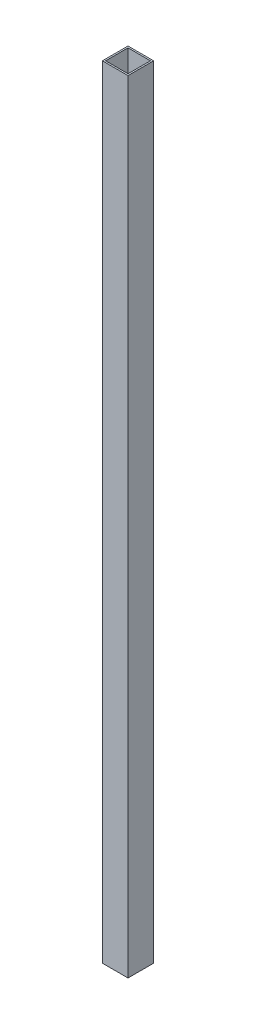
ISO-10303-21;
HEADER;
FILE_DESCRIPTION(('STEP AP214'),'2;1');
FILE_NAME('part.step','',(''),(''),'','','');
FILE_SCHEMA(('AUTOMOTIVE_DESIGN { 1 0 10303 214 1 1 1 1 }'));
ENDSEC;
DATA;
#1=APPLICATION_CONTEXT('core data for automotive mechanical design processes');
#2=APPLICATION_PROTOCOL_DEFINITION('international standard','automotive_design',2000,#1);
#3=PRODUCT_CONTEXT('',#1,'mechanical');
#4=PRODUCT('Part','Part','',(#3));
#5=PRODUCT_RELATED_PRODUCT_CATEGORY('part','',(#4));
#6=PRODUCT_DEFINITION_FORMATION('','',#4);
#7=PRODUCT_DEFINITION_CONTEXT('part definition',#1,'design');
#8=PRODUCT_DEFINITION('design','',#6,#7);
#9=PRODUCT_DEFINITION_SHAPE('','',#8);
#10=(LENGTH_UNIT() NAMED_UNIT(*) SI_UNIT(.MILLI.,.METRE.));
#11=(NAMED_UNIT(*) PLANE_ANGLE_UNIT() SI_UNIT($,.RADIAN.));
#12=(NAMED_UNIT(*) SI_UNIT($,.STERADIAN.) SOLID_ANGLE_UNIT());
#13=UNCERTAINTY_MEASURE_WITH_UNIT(LENGTH_MEASURE(1.E-05),#10,'distance_accuracy_value','');
#14=(GEOMETRIC_REPRESENTATION_CONTEXT(3) GLOBAL_UNCERTAINTY_ASSIGNED_CONTEXT((#13)) GLOBAL_UNIT_ASSIGNED_CONTEXT((#10,
#11,#12)) REPRESENTATION_CONTEXT('',''));
#15=CARTESIAN_POINT('',(0.,0.,0.));
#16=DIRECTION('',(0.,0.,1.));
#17=DIRECTION('',(1.,0.,0.));
#18=AXIS2_PLACEMENT_3D('',#15,#16,#17);
#19=CARTESIAN_POINT('',(-12.7,0.,12.7));
#20=DIRECTION('',(0.,-1.,0.));
#21=DIRECTION('',(0.,0.,-1.));
#22=AXIS2_PLACEMENT_3D('',#19,#20,#21);
#23=PLANE('',#22);
#24=DIRECTION('',(1.,0.,0.));
#25=VECTOR('',#24,1.);
#26=CARTESIAN_POINT('',(0.,0.,-11.1125));
#27=LINE('',#26,#25);
#28=CARTESIAN_POINT('',(-11.1125,0.,-11.1125));
#29=VERTEX_POINT('',#28);
#30=CARTESIAN_POINT('',(11.1125,0.,-11.1125));
#31=VERTEX_POINT('',#30);
#32=EDGE_CURVE('E108',#29,#31,#27,.T.);
#33=ORIENTED_EDGE('',*,*,#32,.F.);
#34=DIRECTION('',(0.,0.,-1.));
#35=VECTOR('',#34,1.);
#36=CARTESIAN_POINT('',(-11.1125,0.,0.));
#37=LINE('',#36,#35);
#38=CARTESIAN_POINT('',(-11.1125,0.,11.1125));
#39=VERTEX_POINT('',#38);
#40=EDGE_CURVE('E110',#39,#29,#37,.T.);
#41=ORIENTED_EDGE('',*,*,#40,.F.);
#42=DIRECTION('',(-1.,0.,0.));
#43=VECTOR('',#42,1.);
#44=CARTESIAN_POINT('',(0.,0.,11.1125));
#45=LINE('',#44,#43);
#46=CARTESIAN_POINT('',(11.1125,0.,11.1125));
#47=VERTEX_POINT('',#46);
#48=EDGE_CURVE('E114',#47,#39,#45,.T.);
#49=ORIENTED_EDGE('',*,*,#48,.F.);
#50=DIRECTION('',(0.,0.,1.));
#51=VECTOR('',#50,1.);
#52=CARTESIAN_POINT('',(11.1125,0.,0.));
#53=LINE('',#52,#51);
#54=EDGE_CURVE('E118',#31,#47,#53,.T.);
#55=ORIENTED_EDGE('',*,*,#54,.F.);
#56=EDGE_LOOP('',(#33,#41,#49,#55));
#57=FACE_BOUND('',#56,.T.);
#58=DIRECTION('',(0.,0.,-1.));
#59=VECTOR('',#58,1.);
#60=CARTESIAN_POINT('',(-12.7,0.,0.));
#61=LINE('',#60,#59);
#62=CARTESIAN_POINT('',(-12.7,0.,12.7));
#63=VERTEX_POINT('',#62);
#64=CARTESIAN_POINT('',(-12.7,0.,-12.7));
#65=VERTEX_POINT('',#64);
#66=EDGE_CURVE('E78',#63,#65,#61,.T.);
#67=ORIENTED_EDGE('',*,*,#66,.T.);
#68=DIRECTION('',(1.,0.,0.));
#69=VECTOR('',#68,1.);
#70=CARTESIAN_POINT('',(0.,0.,-12.7));
#71=LINE('',#70,#69);
#72=CARTESIAN_POINT('',(12.7,0.,-12.7));
#73=VERTEX_POINT('',#72);
#74=EDGE_CURVE('E100',#65,#73,#71,.T.);
#75=ORIENTED_EDGE('',*,*,#74,.T.);
#76=DIRECTION('',(0.,0.,1.));
#77=VECTOR('',#76,1.);
#78=CARTESIAN_POINT('',(12.7,0.,0.));
#79=LINE('',#78,#77);
#80=CARTESIAN_POINT('',(12.7,0.,12.7));
#81=VERTEX_POINT('',#80);
#82=EDGE_CURVE('E82',#73,#81,#79,.T.);
#83=ORIENTED_EDGE('',*,*,#82,.T.);
#84=DIRECTION('',(-1.,0.,0.));
#85=VECTOR('',#84,1.);
#86=CARTESIAN_POINT('',(0.,0.,12.7));
#87=LINE('',#86,#85);
#88=EDGE_CURVE('E20',#81,#63,#87,.T.);
#89=ORIENTED_EDGE('',*,*,#88,.T.);
#90=EDGE_LOOP('',(#67,#75,#83,#89));
#91=FACE_BOUND('',#90,.T.);
#92=ADVANCED_FACE('F16',(#57,#91),#23,.T.);
#93=CARTESIAN_POINT('',(12.7,0.,12.7));
#94=DIRECTION('',(0.,0.,-1.));
#95=DIRECTION('',(-1.,0.,0.));
#96=AXIS2_PLACEMENT_3D('',#93,#94,#95);
#97=PLANE('',#96);
#98=DIRECTION('',(0.,1.,0.));
#99=VECTOR('',#98,1.);
#100=CARTESIAN_POINT('',(12.7,387.35,12.7));
#101=LINE('',#100,#99);
#102=CARTESIAN_POINT('',(12.7,774.7,12.7));
#103=VERTEX_POINT('',#102);
#104=EDGE_CURVE('E102',#81,#103,#101,.T.);
#105=ORIENTED_EDGE('',*,*,#104,.T.);
#106=DIRECTION('',(-1.,0.,0.));
#107=VECTOR('',#106,1.);
#108=CARTESIAN_POINT('',(0.,774.7,12.7));
#109=LINE('',#108,#107);
#110=CARTESIAN_POINT('',(-12.7,774.7,12.7));
#111=VERTEX_POINT('',#110);
#112=EDGE_CURVE('E97',#103,#111,#109,.T.);
#113=ORIENTED_EDGE('',*,*,#112,.T.);
#114=DIRECTION('',(0.,-1.,0.));
#115=VECTOR('',#114,1.);
#116=CARTESIAN_POINT('',(-12.7,387.35,12.7));
#117=LINE('',#116,#115);
#118=EDGE_CURVE('E87',#111,#63,#117,.T.);
#119=ORIENTED_EDGE('',*,*,#118,.T.);
#120=ORIENTED_EDGE('',*,*,#88,.F.);
#121=EDGE_LOOP('',(#105,#113,#119,#120));
#122=FACE_BOUND('',#121,.T.);
#123=ADVANCED_FACE('F96',(#122),#97,.F.);
#124=CARTESIAN_POINT('',(-12.7,0.,12.7));
#125=DIRECTION('',(1.,0.,0.));
#126=DIRECTION('',(0.,0.,-1.));
#127=AXIS2_PLACEMENT_3D('',#124,#125,#126);
#128=PLANE('',#127);
#129=ORIENTED_EDGE('',*,*,#118,.F.);
#130=DIRECTION('',(0.,0.,-1.));
#131=VECTOR('',#130,1.);
#132=CARTESIAN_POINT('',(-12.7,774.7,0.));
#133=LINE('',#132,#131);
#134=CARTESIAN_POINT('',(-12.7,774.7,-12.7));
#135=VERTEX_POINT('',#134);
#136=EDGE_CURVE('E125',#111,#135,#133,.T.);
#137=ORIENTED_EDGE('',*,*,#136,.T.);
#138=DIRECTION('',(0.,-1.,0.));
#139=VECTOR('',#138,1.);
#140=CARTESIAN_POINT('',(-12.7,387.35,-12.7));
#141=LINE('',#140,#139);
#142=EDGE_CURVE('E93',#135,#65,#141,.T.);
#143=ORIENTED_EDGE('',*,*,#142,.T.);
#144=ORIENTED_EDGE('',*,*,#66,.F.);
#145=EDGE_LOOP('',(#129,#137,#143,#144));
#146=FACE_BOUND('',#145,.T.);
#147=ADVANCED_FACE('F90',(#146),#128,.F.);
#148=CARTESIAN_POINT('',(-12.7,0.,-12.7));
#149=DIRECTION('',(0.,0.,1.));
#150=DIRECTION('',(1.,0.,0.));
#151=AXIS2_PLACEMENT_3D('',#148,#149,#150);
#152=PLANE('',#151);
#153=ORIENTED_EDGE('',*,*,#142,.F.);
#154=DIRECTION('',(1.,0.,0.));
#155=VECTOR('',#154,1.);
#156=CARTESIAN_POINT('',(0.,774.7,-12.7));
#157=LINE('',#156,#155);
#158=CARTESIAN_POINT('',(12.7,774.7,-12.7));
#159=VERTEX_POINT('',#158);
#160=EDGE_CURVE('E127',#135,#159,#157,.T.);
#161=ORIENTED_EDGE('',*,*,#160,.T.);
#162=DIRECTION('',(0.,-1.,0.));
#163=VECTOR('',#162,1.);
#164=CARTESIAN_POINT('',(12.7,387.35,-12.7));
#165=LINE('',#164,#163);
#166=EDGE_CURVE('E104',#159,#73,#165,.T.);
#167=ORIENTED_EDGE('',*,*,#166,.T.);
#168=ORIENTED_EDGE('',*,*,#74,.F.);
#169=EDGE_LOOP('',(#153,#161,#167,#168));
#170=FACE_BOUND('',#169,.T.);
#171=ADVANCED_FACE('F172',(#170),#152,.F.);
#172=CARTESIAN_POINT('',(12.7,0.,-12.7));
#173=DIRECTION('',(-1.,0.,0.));
#174=DIRECTION('',(0.,0.,1.));
#175=AXIS2_PLACEMENT_3D('',#172,#173,#174);
#176=PLANE('',#175);
#177=ORIENTED_EDGE('',*,*,#166,.F.);
#178=DIRECTION('',(0.,0.,1.));
#179=VECTOR('',#178,1.);
#180=CARTESIAN_POINT('',(12.7,774.7,0.));
#181=LINE('',#180,#179);
#182=EDGE_CURVE('E130',#159,#103,#181,.T.);
#183=ORIENTED_EDGE('',*,*,#182,.T.);
#184=ORIENTED_EDGE('',*,*,#104,.F.);
#185=ORIENTED_EDGE('',*,*,#82,.F.);
#186=EDGE_LOOP('',(#177,#183,#184,#185));
#187=FACE_BOUND('',#186,.T.);
#188=ADVANCED_FACE('F169',(#187),#176,.F.);
#189=CARTESIAN_POINT('',(-11.1125,0.,-11.1125));
#190=DIRECTION('',(0.,0.,1.));
#191=DIRECTION('',(1.,0.,0.));
#192=AXIS2_PLACEMENT_3D('',#189,#190,#191);
#193=PLANE('',#192);
#194=DIRECTION('',(-1.,0.,0.));
#195=VECTOR('',#194,1.);
#196=CARTESIAN_POINT('',(0.,774.7,-11.1125));
#197=LINE('',#196,#195);
#198=CARTESIAN_POINT('',(11.1125,774.7,-11.1125));
#199=VERTEX_POINT('',#198);
#200=CARTESIAN_POINT('',(-11.1125,774.7,-11.1125));
#201=VERTEX_POINT('',#200);
#202=EDGE_CURVE('E133',#199,#201,#197,.T.);
#203=ORIENTED_EDGE('',*,*,#202,.T.);
#204=DIRECTION('',(0.,1.,0.));
#205=VECTOR('',#204,1.);
#206=CARTESIAN_POINT('',(-11.1125,387.35,-11.1125));
#207=LINE('',#206,#205);
#208=EDGE_CURVE('E112',#29,#201,#207,.T.);
#209=ORIENTED_EDGE('',*,*,#208,.F.);
#210=ORIENTED_EDGE('',*,*,#32,.T.);
#211=DIRECTION('',(0.,-1.,0.));
#212=VECTOR('',#211,1.);
#213=CARTESIAN_POINT('',(11.1125,387.35,-11.1125));
#214=LINE('',#213,#212);
#215=EDGE_CURVE('E121',#199,#31,#214,.T.);
#216=ORIENTED_EDGE('',*,*,#215,.F.);
#217=EDGE_LOOP('',(#203,#209,#210,#216));
#218=FACE_BOUND('',#217,.T.);
#219=ADVANCED_FACE('F153',(#218),#193,.T.);
#220=CARTESIAN_POINT('',(-11.1125,0.,11.1125));
#221=DIRECTION('',(1.,0.,0.));
#222=DIRECTION('',(0.,0.,-1.));
#223=AXIS2_PLACEMENT_3D('',#220,#221,#222);
#224=PLANE('',#223);
#225=DIRECTION('',(0.,0.,1.));
#226=VECTOR('',#225,1.);
#227=CARTESIAN_POINT('',(-11.1125,774.7,0.));
#228=LINE('',#227,#226);
#229=CARTESIAN_POINT('',(-11.1125,774.7,11.1125));
#230=VERTEX_POINT('',#229);
#231=EDGE_CURVE('E136',#201,#230,#228,.T.);
#232=ORIENTED_EDGE('',*,*,#231,.T.);
#233=DIRECTION('',(0.,1.,0.));
#234=VECTOR('',#233,1.);
#235=CARTESIAN_POINT('',(-11.1125,387.35,11.1125));
#236=LINE('',#235,#234);
#237=EDGE_CURVE('E116',#39,#230,#236,.T.);
#238=ORIENTED_EDGE('',*,*,#237,.F.);
#239=ORIENTED_EDGE('',*,*,#40,.T.);
#240=ORIENTED_EDGE('',*,*,#208,.T.);
#241=EDGE_LOOP('',(#232,#238,#239,#240));
#242=FACE_BOUND('',#241,.T.);
#243=ADVANCED_FACE('F148',(#242),#224,.T.);
#244=CARTESIAN_POINT('',(11.1125,0.,11.1125));
#245=DIRECTION('',(0.,0.,-1.));
#246=DIRECTION('',(-1.,0.,0.));
#247=AXIS2_PLACEMENT_3D('',#244,#245,#246);
#248=PLANE('',#247);
#249=DIRECTION('',(1.,0.,0.));
#250=VECTOR('',#249,1.);
#251=CARTESIAN_POINT('',(0.,774.7,11.1125));
#252=LINE('',#251,#250);
#253=CARTESIAN_POINT('',(11.1125,774.7,11.1125));
#254=VERTEX_POINT('',#253);
#255=EDGE_CURVE('E26',#230,#254,#252,.T.);
#256=ORIENTED_EDGE('',*,*,#255,.T.);
#257=DIRECTION('',(0.,1.,0.));
#258=VECTOR('',#257,1.);
#259=CARTESIAN_POINT('',(11.1125,387.35,11.1125));
#260=LINE('',#259,#258);
#261=EDGE_CURVE('E34',#47,#254,#260,.T.);
#262=ORIENTED_EDGE('',*,*,#261,.F.);
#263=ORIENTED_EDGE('',*,*,#48,.T.);
#264=ORIENTED_EDGE('',*,*,#237,.T.);
#265=EDGE_LOOP('',(#256,#262,#263,#264));
#266=FACE_BOUND('',#265,.T.);
#267=ADVANCED_FACE('F142',(#266),#248,.T.);
#268=CARTESIAN_POINT('',(11.1125,0.,-11.1125));
#269=DIRECTION('',(-1.,0.,0.));
#270=DIRECTION('',(0.,0.,1.));
#271=AXIS2_PLACEMENT_3D('',#268,#269,#270);
#272=PLANE('',#271);
#273=DIRECTION('',(0.,0.,-1.));
#274=VECTOR('',#273,1.);
#275=CARTESIAN_POINT('',(11.1125,774.7,0.));
#276=LINE('',#275,#274);
#277=EDGE_CURVE('E11',#254,#199,#276,.T.);
#278=ORIENTED_EDGE('',*,*,#277,.T.);
#279=ORIENTED_EDGE('',*,*,#215,.T.);
#280=ORIENTED_EDGE('',*,*,#54,.T.);
#281=ORIENTED_EDGE('',*,*,#261,.T.);
#282=EDGE_LOOP('',(#278,#279,#280,#281));
#283=FACE_BOUND('',#282,.T.);
#284=ADVANCED_FACE('F156',(#283),#272,.T.);
#285=CARTESIAN_POINT('',(-12.7,774.7,12.7));
#286=DIRECTION('',(0.,-1.,0.));
#287=DIRECTION('',(0.,0.,-1.));
#288=AXIS2_PLACEMENT_3D('',#285,#286,#287);
#289=PLANE('',#288);
#290=ORIENTED_EDGE('',*,*,#255,.F.);
#291=ORIENTED_EDGE('',*,*,#231,.F.);
#292=ORIENTED_EDGE('',*,*,#202,.F.);
#293=ORIENTED_EDGE('',*,*,#277,.F.);
#294=EDGE_LOOP('',(#290,#291,#292,#293));
#295=FACE_BOUND('',#294,.T.);
#296=ORIENTED_EDGE('',*,*,#160,.F.);
#297=ORIENTED_EDGE('',*,*,#136,.F.);
#298=ORIENTED_EDGE('',*,*,#112,.F.);
#299=ORIENTED_EDGE('',*,*,#182,.F.);
#300=EDGE_LOOP('',(#296,#297,#298,#299));
#301=FACE_BOUND('',#300,.T.);
#302=ADVANCED_FACE('F18',(#295,#301),#289,.F.);
#303=CLOSED_SHELL('',(#92,#123,#147,#171,#188,#219,#243,#267,#284,#302));
#304=MANIFOLD_SOLID_BREP('B1',#303);
#305=ADVANCED_BREP_SHAPE_REPRESENTATION('',(#18,#304),#14);
#306=SHAPE_DEFINITION_REPRESENTATION(#9,#305);
ENDSEC;
END-ISO-10303-21;
